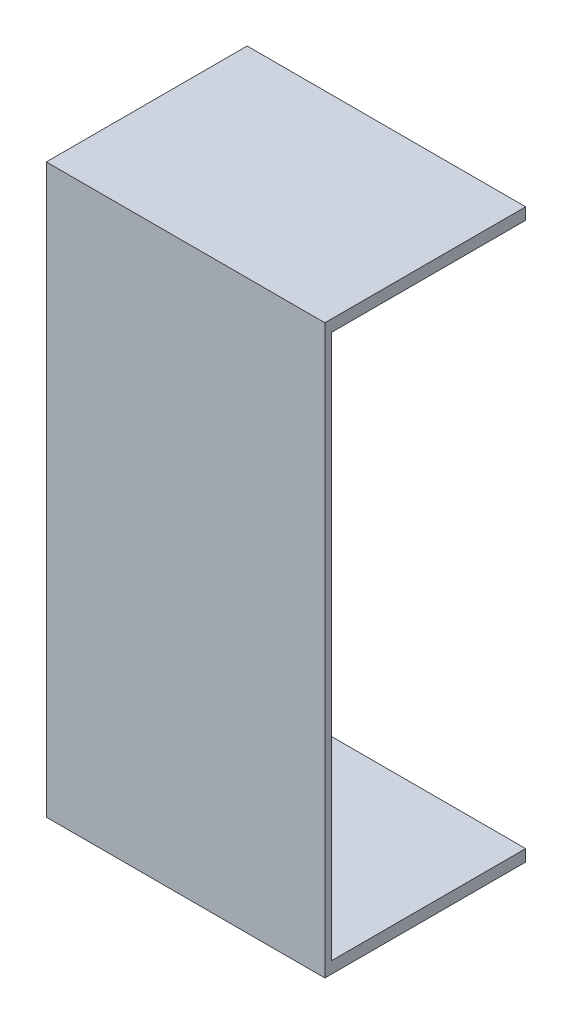
ISO-10303-21;
HEADER;
FILE_DESCRIPTION(('STEP AP214'),'2;1');
FILE_NAME('part.step','',(''),(''),'','','');
FILE_SCHEMA(('AUTOMOTIVE_DESIGN { 1 0 10303 214 1 1 1 1 }'));
ENDSEC;
DATA;
#1=APPLICATION_CONTEXT('core data for automotive mechanical design processes');
#2=APPLICATION_PROTOCOL_DEFINITION('international standard','automotive_design',2000,#1);
#3=PRODUCT_CONTEXT('',#1,'mechanical');
#4=PRODUCT('Part','Part','',(#3));
#5=PRODUCT_RELATED_PRODUCT_CATEGORY('part','',(#4));
#6=PRODUCT_DEFINITION_FORMATION('','',#4);
#7=PRODUCT_DEFINITION_CONTEXT('part definition',#1,'design');
#8=PRODUCT_DEFINITION('design','',#6,#7);
#9=PRODUCT_DEFINITION_SHAPE('','',#8);
#10=(LENGTH_UNIT() NAMED_UNIT(*) SI_UNIT(.MILLI.,.METRE.));
#11=(NAMED_UNIT(*) PLANE_ANGLE_UNIT() SI_UNIT($,.RADIAN.));
#12=(NAMED_UNIT(*) SI_UNIT($,.STERADIAN.) SOLID_ANGLE_UNIT());
#13=UNCERTAINTY_MEASURE_WITH_UNIT(LENGTH_MEASURE(1.E-05),#10,'distance_accuracy_value','');
#14=(GEOMETRIC_REPRESENTATION_CONTEXT(3) GLOBAL_UNCERTAINTY_ASSIGNED_CONTEXT((#13)) GLOBAL_UNIT_ASSIGNED_CONTEXT((#10,
#11,#12)) REPRESENTATION_CONTEXT('',''));
#15=CARTESIAN_POINT('',(0.,0.,0.));
#16=DIRECTION('',(0.,0.,1.));
#17=DIRECTION('',(1.,0.,0.));
#18=AXIS2_PLACEMENT_3D('',#15,#16,#17);
#19=CARTESIAN_POINT('',(-38.0765906781288,1.20000000000004,44.));
#20=DIRECTION('',(0.,0.,-1.));
#21=DIRECTION('',(0.,1.,0.));
#22=AXIS2_PLACEMENT_3D('',#19,#20,#21);
#23=PLANE('',#22);
#24=DIRECTION('',(0.,-1.,0.));
#25=VECTOR('',#24,1.);
#26=CARTESIAN_POINT('',(-131.,1.2,44.));
#27=LINE('',#26,#25);
#28=CARTESIAN_POINT('',(-131.,88.8,43.9999999999999));
#29=VERTEX_POINT('',#28);
#30=CARTESIAN_POINT('',(-131.,1.20000000000003,44.));
#31=VERTEX_POINT('',#30);
#32=EDGE_CURVE('E170',#29,#31,#27,.T.);
#33=ORIENTED_EDGE('',*,*,#32,.F.);
#34=DIRECTION('',(-1.,0.,0.));
#35=VECTOR('',#34,1.);
#36=CARTESIAN_POINT('',(-38.0765906781288,88.8,43.9999999999998));
#37=LINE('',#36,#35);
#38=CARTESIAN_POINT('',(-174.,88.8,43.9999999999999));
#39=VERTEX_POINT('',#38);
#40=EDGE_CURVE('E111',#29,#39,#37,.T.);
#41=ORIENTED_EDGE('',*,*,#40,.T.);
#42=DIRECTION('',(0.,-1.,0.));
#43=VECTOR('',#42,1.);
#44=CARTESIAN_POINT('',(-174.,1.20000000000001,44.));
#45=LINE('',#44,#43);
#46=CARTESIAN_POINT('',(-174.,1.20000000000001,44.));
#47=VERTEX_POINT('',#46);
#48=EDGE_CURVE('E101',#39,#47,#45,.T.);
#49=ORIENTED_EDGE('',*,*,#48,.T.);
#50=DIRECTION('',(-1.,0.,0.));
#51=VECTOR('',#50,1.);
#52=CARTESIAN_POINT('',(-38.0765906781288,1.20000000000004,44.));
#53=LINE('',#52,#51);
#54=EDGE_CURVE('E93',#31,#47,#53,.T.);
#55=ORIENTED_EDGE('',*,*,#54,.F.);
#56=EDGE_LOOP('',(#33,#41,#49,#55));
#57=FACE_BOUND('',#56,.T.);
#58=ADVANCED_FACE('F34',(#57),#23,.F.);
#59=CARTESIAN_POINT('',(-38.0765906781288,1.20000000000004,44.));
#60=DIRECTION('',(0.,1.,0.));
#61=DIRECTION('',(0.,0.,1.));
#62=AXIS2_PLACEMENT_3D('',#59,#60,#61);
#63=PLANE('',#62);
#64=DIRECTION('',(0.,0.,-1.));
#65=VECTOR('',#64,1.);
#66=CARTESIAN_POINT('',(-131.,1.20000000000002,44.));
#67=LINE('',#66,#65);
#68=CARTESIAN_POINT('',(-131.,1.19999999999998,13.));
#69=VERTEX_POINT('',#68);
#70=EDGE_CURVE('E44',#31,#69,#67,.T.);
#71=ORIENTED_EDGE('',*,*,#70,.F.);
#72=ORIENTED_EDGE('',*,*,#54,.T.);
#73=DIRECTION('',(0.,0.,-1.));
#74=VECTOR('',#73,1.);
#75=CARTESIAN_POINT('',(-174.,1.20000000000001,44.));
#76=LINE('',#75,#74);
#77=CARTESIAN_POINT('',(-174.,1.19999999999997,13.));
#78=VERTEX_POINT('',#77);
#79=EDGE_CURVE('E96',#47,#78,#76,.T.);
#80=ORIENTED_EDGE('',*,*,#79,.T.);
#81=DIRECTION('',(-1.,0.,0.));
#82=VECTOR('',#81,1.);
#83=CARTESIAN_POINT('',(-38.0765906781288,1.19999999999999,13.));
#84=LINE('',#83,#82);
#85=EDGE_CURVE('E87',#69,#78,#84,.T.);
#86=ORIENTED_EDGE('',*,*,#85,.F.);
#87=EDGE_LOOP('',(#71,#72,#80,#86));
#88=FACE_BOUND('',#87,.T.);
#89=ADVANCED_FACE('F95',(#88),#63,.F.);
#90=CARTESIAN_POINT('',(-38.0765906781288,1.19999999999999,13.));
#91=DIRECTION('',(0.,0.,1.));
#92=DIRECTION('',(0.,-1.,0.));
#93=AXIS2_PLACEMENT_3D('',#90,#91,#92);
#94=PLANE('',#93);
#95=DIRECTION('',(0.,1.,0.));
#96=VECTOR('',#95,1.);
#97=CARTESIAN_POINT('',(-131.,1.19999999999995,13.));
#98=LINE('',#97,#96);
#99=CARTESIAN_POINT('',(-131.,3.,13.));
#100=VERTEX_POINT('',#99);
#101=EDGE_CURVE('E11',#69,#100,#98,.T.);
#102=ORIENTED_EDGE('',*,*,#101,.F.);
#103=ORIENTED_EDGE('',*,*,#85,.T.);
#104=DIRECTION('',(0.,1.,0.));
#105=VECTOR('',#104,1.);
#106=CARTESIAN_POINT('',(-174.,1.19999999999997,13.));
#107=LINE('',#106,#105);
#108=CARTESIAN_POINT('',(-174.,2.99999999999998,13.));
#109=VERTEX_POINT('',#108);
#110=EDGE_CURVE('E108',#78,#109,#107,.T.);
#111=ORIENTED_EDGE('',*,*,#110,.T.);
#112=DIRECTION('',(-1.,0.,0.));
#113=VECTOR('',#112,1.);
#114=CARTESIAN_POINT('',(-38.0765906781288,3.00000000000001,13.));
#115=LINE('',#114,#113);
#116=EDGE_CURVE('E118',#100,#109,#115,.T.);
#117=ORIENTED_EDGE('',*,*,#116,.F.);
#118=EDGE_LOOP('',(#102,#103,#111,#117));
#119=FACE_BOUND('',#118,.T.);
#120=ADVANCED_FACE('F150',(#119),#94,.F.);
#121=CARTESIAN_POINT('',(-38.0765906781288,3.00000000000001,13.));
#122=DIRECTION('',(0.,-1.,0.));
#123=DIRECTION('',(0.,0.,-1.));
#124=AXIS2_PLACEMENT_3D('',#121,#122,#123);
#125=PLANE('',#124);
#126=DIRECTION('',(0.,0.,1.));
#127=VECTOR('',#126,1.);
#128=CARTESIAN_POINT('',(-131.,2.99999999999999,13.));
#129=LINE('',#128,#127);
#130=CARTESIAN_POINT('',(-131.,3.,43.));
#131=VERTEX_POINT('',#130);
#132=EDGE_CURVE('E132',#100,#131,#129,.T.);
#133=ORIENTED_EDGE('',*,*,#132,.F.);
#134=ORIENTED_EDGE('',*,*,#116,.T.);
#135=DIRECTION('',(0.,0.,1.));
#136=VECTOR('',#135,1.);
#137=CARTESIAN_POINT('',(-174.,2.99999999999998,13.));
#138=LINE('',#137,#136);
#139=CARTESIAN_POINT('',(-174.,3.,43.));
#140=VERTEX_POINT('',#139);
#141=EDGE_CURVE('E120',#109,#140,#138,.T.);
#142=ORIENTED_EDGE('',*,*,#141,.T.);
#143=DIRECTION('',(-1.,0.,0.));
#144=VECTOR('',#143,1.);
#145=CARTESIAN_POINT('',(-38.0765906781288,3.00000000000002,43.));
#146=LINE('',#145,#144);
#147=EDGE_CURVE('E121',#131,#140,#146,.T.);
#148=ORIENTED_EDGE('',*,*,#147,.F.);
#149=EDGE_LOOP('',(#133,#134,#142,#148));
#150=FACE_BOUND('',#149,.T.);
#151=ADVANCED_FACE('F155',(#150),#125,.F.);
#152=CARTESIAN_POINT('',(-38.0765906781288,87.,42.9999999999998));
#153=DIRECTION('',(0.,0.,1.));
#154=DIRECTION('',(0.,-1.,0.));
#155=AXIS2_PLACEMENT_3D('',#152,#153,#154);
#156=PLANE('',#155);
#157=DIRECTION('',(0.,1.,0.));
#158=VECTOR('',#157,1.);
#159=CARTESIAN_POINT('',(-131.,87.,42.9999999999999));
#160=LINE('',#159,#158);
#161=CARTESIAN_POINT('',(-131.,87.,42.9999999999999));
#162=VERTEX_POINT('',#161);
#163=EDGE_CURVE('E38',#131,#162,#160,.T.);
#164=ORIENTED_EDGE('',*,*,#163,.F.);
#165=ORIENTED_EDGE('',*,*,#147,.T.);
#166=DIRECTION('',(0.,1.,0.));
#167=VECTOR('',#166,1.);
#168=CARTESIAN_POINT('',(-174.,87.,42.9999999999999));
#169=LINE('',#168,#167);
#170=CARTESIAN_POINT('',(-174.,87.,42.9999999999999));
#171=VERTEX_POINT('',#170);
#172=EDGE_CURVE('E123',#140,#171,#169,.T.);
#173=ORIENTED_EDGE('',*,*,#172,.T.);
#174=DIRECTION('',(-1.,0.,0.));
#175=VECTOR('',#174,1.);
#176=CARTESIAN_POINT('',(-38.0765906781288,87.,42.9999999999998));
#177=LINE('',#176,#175);
#178=EDGE_CURVE('E124',#162,#171,#177,.T.);
#179=ORIENTED_EDGE('',*,*,#178,.F.);
#180=EDGE_LOOP('',(#164,#165,#173,#179));
#181=FACE_BOUND('',#180,.T.);
#182=ADVANCED_FACE('F158',(#181),#156,.F.);
#183=CARTESIAN_POINT('',(-38.0765906781288,87.,42.9999999999998));
#184=DIRECTION('',(0.,1.,0.));
#185=DIRECTION('',(0.,0.,1.));
#186=AXIS2_PLACEMENT_3D('',#183,#184,#185);
#187=PLANE('',#186);
#188=DIRECTION('',(0.,0.,-1.));
#189=VECTOR('',#188,1.);
#190=CARTESIAN_POINT('',(-131.,87.,42.9999999999998));
#191=LINE('',#190,#189);
#192=CARTESIAN_POINT('',(-131.,87.,12.9999999999999));
#193=VERTEX_POINT('',#192);
#194=EDGE_CURVE('E135',#162,#193,#191,.T.);
#195=ORIENTED_EDGE('',*,*,#194,.F.);
#196=ORIENTED_EDGE('',*,*,#178,.T.);
#197=DIRECTION('',(0.,0.,-1.));
#198=VECTOR('',#197,1.);
#199=CARTESIAN_POINT('',(-174.,87.,42.9999999999999));
#200=LINE('',#199,#198);
#201=CARTESIAN_POINT('',(-174.,87.,12.9999999999999));
#202=VERTEX_POINT('',#201);
#203=EDGE_CURVE('E126',#171,#202,#200,.T.);
#204=ORIENTED_EDGE('',*,*,#203,.T.);
#205=DIRECTION('',(-1.,0.,0.));
#206=VECTOR('',#205,1.);
#207=CARTESIAN_POINT('',(-38.0765906781289,87.,12.9999999999998));
#208=LINE('',#207,#206);
#209=EDGE_CURVE('E127',#193,#202,#208,.T.);
#210=ORIENTED_EDGE('',*,*,#209,.F.);
#211=EDGE_LOOP('',(#195,#196,#204,#210));
#212=FACE_BOUND('',#211,.T.);
#213=ADVANCED_FACE('F165',(#212),#187,.F.);
#214=CARTESIAN_POINT('',(-38.0765906781289,87.,12.9999999999998));
#215=DIRECTION('',(0.,0.,1.));
#216=DIRECTION('',(0.,-1.,0.));
#217=AXIS2_PLACEMENT_3D('',#214,#215,#216);
#218=PLANE('',#217);
#219=DIRECTION('',(0.,1.,0.));
#220=VECTOR('',#219,1.);
#221=CARTESIAN_POINT('',(-131.,86.9999999999999,12.9999999999999));
#222=LINE('',#221,#220);
#223=CARTESIAN_POINT('',(-131.,88.8,12.9999999999999));
#224=VERTEX_POINT('',#223);
#225=EDGE_CURVE('E166',#193,#224,#222,.T.);
#226=ORIENTED_EDGE('',*,*,#225,.F.);
#227=ORIENTED_EDGE('',*,*,#209,.T.);
#228=DIRECTION('',(0.,1.,0.));
#229=VECTOR('',#228,1.);
#230=CARTESIAN_POINT('',(-174.,87.,12.9999999999999));
#231=LINE('',#230,#229);
#232=CARTESIAN_POINT('',(-174.,88.8,12.9999999999999));
#233=VERTEX_POINT('',#232);
#234=EDGE_CURVE('E129',#202,#233,#231,.T.);
#235=ORIENTED_EDGE('',*,*,#234,.T.);
#236=DIRECTION('',(-1.,0.,0.));
#237=VECTOR('',#236,1.);
#238=CARTESIAN_POINT('',(-38.0765906781289,88.8,12.9999999999998));
#239=LINE('',#238,#237);
#240=EDGE_CURVE('E130',#224,#233,#239,.T.);
#241=ORIENTED_EDGE('',*,*,#240,.F.);
#242=EDGE_LOOP('',(#226,#227,#235,#241));
#243=FACE_BOUND('',#242,.T.);
#244=ADVANCED_FACE('F178',(#243),#218,.F.);
#245=CARTESIAN_POINT('',(-38.0765906781288,88.8,43.9999999999998));
#246=DIRECTION('',(0.,-1.,0.));
#247=DIRECTION('',(0.,0.,-1.));
#248=AXIS2_PLACEMENT_3D('',#245,#246,#247);
#249=PLANE('',#248);
#250=DIRECTION('',(0.,0.,1.));
#251=VECTOR('',#250,1.);
#252=CARTESIAN_POINT('',(-131.,88.8,43.9999999999998));
#253=LINE('',#252,#251);
#254=EDGE_CURVE('E140',#224,#29,#253,.T.);
#255=ORIENTED_EDGE('',*,*,#254,.F.);
#256=ORIENTED_EDGE('',*,*,#240,.T.);
#257=DIRECTION('',(0.,0.,1.));
#258=VECTOR('',#257,1.);
#259=CARTESIAN_POINT('',(-174.,88.8,43.9999999999999));
#260=LINE('',#259,#258);
#261=EDGE_CURVE('E131',#233,#39,#260,.T.);
#262=ORIENTED_EDGE('',*,*,#261,.T.);
#263=ORIENTED_EDGE('',*,*,#40,.F.);
#264=EDGE_LOOP('',(#255,#256,#262,#263));
#265=FACE_BOUND('',#264,.T.);
#266=ADVANCED_FACE('F176',(#265),#249,.F.);
#267=CARTESIAN_POINT('',(-174.,0.,1.55789359907078E-13));
#268=DIRECTION('',(-1.,0.,0.));
#269=DIRECTION('',(0.,0.,1.));
#270=AXIS2_PLACEMENT_3D('',#267,#268,#269);
#271=PLANE('',#270);
#272=ORIENTED_EDGE('',*,*,#48,.F.);
#273=ORIENTED_EDGE('',*,*,#261,.F.);
#274=ORIENTED_EDGE('',*,*,#234,.F.);
#275=ORIENTED_EDGE('',*,*,#203,.F.);
#276=ORIENTED_EDGE('',*,*,#172,.F.);
#277=ORIENTED_EDGE('',*,*,#141,.F.);
#278=ORIENTED_EDGE('',*,*,#110,.F.);
#279=ORIENTED_EDGE('',*,*,#79,.F.);
#280=EDGE_LOOP('',(#272,#273,#274,#275,#276,#277,#278,#279));
#281=FACE_BOUND('',#280,.T.);
#282=ADVANCED_FACE('F105',(#281),#271,.T.);
#283=CARTESIAN_POINT('',(-131.,13.,-1.14213562373127));
#284=DIRECTION('',(1.,0.,0.));
#285=DIRECTION('',(0.,0.,-1.));
#286=AXIS2_PLACEMENT_3D('',#283,#284,#285);
#287=PLANE('',#286);
#288=ORIENTED_EDGE('',*,*,#132,.T.);
#289=ORIENTED_EDGE('',*,*,#163,.T.);
#290=ORIENTED_EDGE('',*,*,#194,.T.);
#291=ORIENTED_EDGE('',*,*,#225,.T.);
#292=ORIENTED_EDGE('',*,*,#254,.T.);
#293=ORIENTED_EDGE('',*,*,#32,.T.);
#294=ORIENTED_EDGE('',*,*,#70,.T.);
#295=ORIENTED_EDGE('',*,*,#101,.T.);
#296=EDGE_LOOP('',(#288,#289,#290,#291,#292,#293,#294,#295));
#297=FACE_BOUND('',#296,.T.);
#298=ADVANCED_FACE('F36',(#297),#287,.T.);
#299=CLOSED_SHELL('',(#58,#89,#120,#151,#182,#213,#244,#266,#282,#298));
#300=MANIFOLD_SOLID_BREP('B2',#299);
#301=ADVANCED_BREP_SHAPE_REPRESENTATION('',(#18,#300),#14);
#302=SHAPE_DEFINITION_REPRESENTATION(#9,#301);
ENDSEC;
END-ISO-10303-21;
